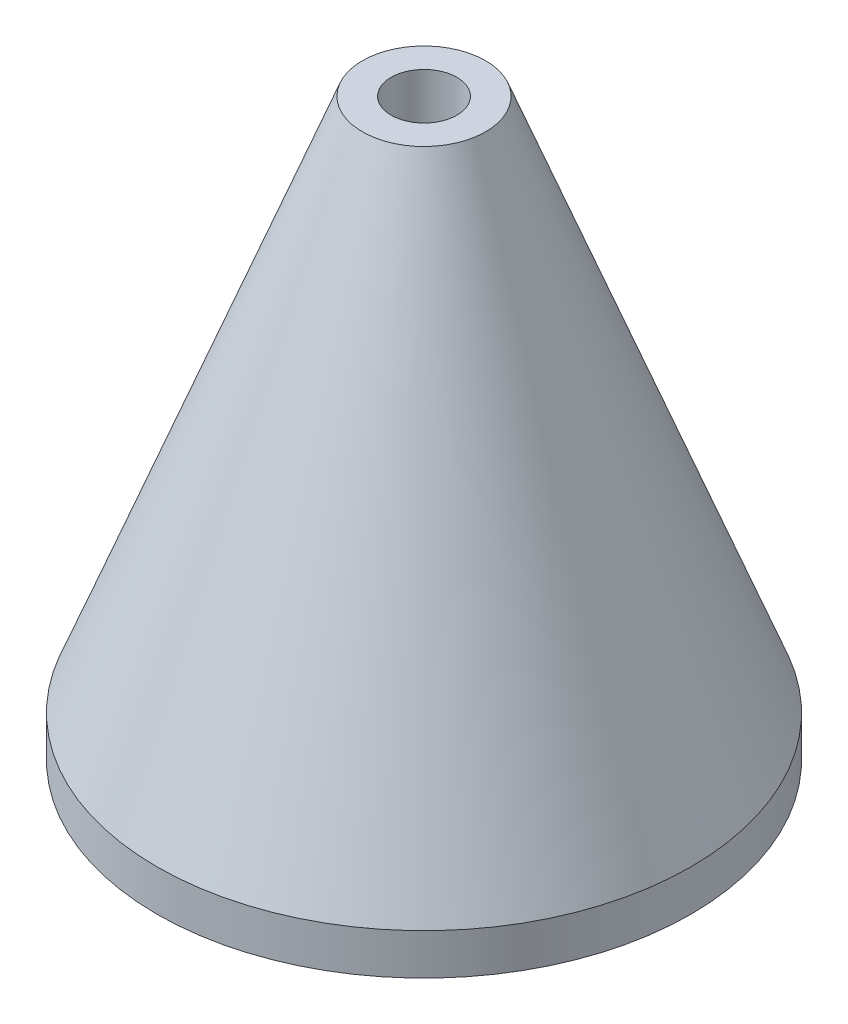
ISO-10303-21;
HEADER;
FILE_DESCRIPTION(('STEP AP214'),'2;1');
FILE_NAME('part.step','',(''),(''),'','','');
FILE_SCHEMA(('AUTOMOTIVE_DESIGN { 1 0 10303 214 1 1 1 1 }'));
ENDSEC;
DATA;
#1=APPLICATION_CONTEXT('core data for automotive mechanical design processes');
#2=APPLICATION_PROTOCOL_DEFINITION('international standard','automotive_design',2000,#1);
#3=PRODUCT_CONTEXT('',#1,'mechanical');
#4=PRODUCT('Part','Part','',(#3));
#5=PRODUCT_RELATED_PRODUCT_CATEGORY('part','',(#4));
#6=PRODUCT_DEFINITION_FORMATION('','',#4);
#7=PRODUCT_DEFINITION_CONTEXT('part definition',#1,'design');
#8=PRODUCT_DEFINITION('design','',#6,#7);
#9=PRODUCT_DEFINITION_SHAPE('','',#8);
#10=(LENGTH_UNIT() NAMED_UNIT(*) SI_UNIT(.MILLI.,.METRE.));
#11=(NAMED_UNIT(*) PLANE_ANGLE_UNIT() SI_UNIT($,.RADIAN.));
#12=(NAMED_UNIT(*) SI_UNIT($,.STERADIAN.) SOLID_ANGLE_UNIT());
#13=UNCERTAINTY_MEASURE_WITH_UNIT(LENGTH_MEASURE(1.E-05),#10,'distance_accuracy_value','');
#14=(GEOMETRIC_REPRESENTATION_CONTEXT(3) GLOBAL_UNCERTAINTY_ASSIGNED_CONTEXT((#13)) GLOBAL_UNIT_ASSIGNED_CONTEXT((#10,
#11,#12)) REPRESENTATION_CONTEXT('',''));
#15=CARTESIAN_POINT('',(0.,0.,0.));
#16=DIRECTION('',(0.,0.,1.));
#17=DIRECTION('',(1.,0.,0.));
#18=AXIS2_PLACEMENT_3D('',#15,#16,#17);
#19=CARTESIAN_POINT('',(0.,0.,0.));
#20=DIRECTION('',(0.,1.,0.));
#21=DIRECTION('',(0.,0.,1.));
#22=AXIS2_PLACEMENT_3D('',#19,#20,#21);
#23=CYLINDRICAL_SURFACE('',#22,2.1);
#24=CARTESIAN_POINT('',(0.,23.5,0.));
#25=DIRECTION('',(0.,1.,0.));
#26=DIRECTION('',(0.,0.,1.));
#27=AXIS2_PLACEMENT_3D('',#24,#25,#26);
#28=CIRCLE('',#27,2.1);
#29=CARTESIAN_POINT('',(0.,23.5,2.1));
#30=VERTEX_POINT('',#29);
#31=EDGE_CURVE('E10',#30,#30,#28,.T.);
#32=ORIENTED_EDGE('',*,*,#31,.T.);
#33=EDGE_LOOP('',(#32));
#34=FACE_BOUND('',#33,.T.);
#35=CARTESIAN_POINT('',(0.,0.,0.));
#36=DIRECTION('',(0.,1.,0.));
#37=DIRECTION('',(0.,0.,1.));
#38=AXIS2_PLACEMENT_3D('',#35,#36,#37);
#39=CIRCLE('',#38,2.1);
#40=CARTESIAN_POINT('',(0.,0.,2.1));
#41=VERTEX_POINT('',#40);
#42=EDGE_CURVE('E59',#41,#41,#39,.T.);
#43=ORIENTED_EDGE('',*,*,#42,.F.);
#44=EDGE_LOOP('',(#43));
#45=FACE_BOUND('',#44,.T.);
#46=ADVANCED_FACE('F38',(#34,#45),#23,.F.);
#47=CARTESIAN_POINT('',(0.,0.,0.));
#48=DIRECTION('',(0.,1.,0.));
#49=DIRECTION('',(0.,0.,1.));
#50=AXIS2_PLACEMENT_3D('',#47,#48,#49);
#51=PLANE('',#50);
#52=ORIENTED_EDGE('',*,*,#42,.T.);
#53=EDGE_LOOP('',(#52));
#54=FACE_BOUND('',#53,.T.);
#55=CARTESIAN_POINT('',(0.,0.,0.));
#56=DIRECTION('',(0.,1.,0.));
#57=DIRECTION('',(0.,0.,1.));
#58=AXIS2_PLACEMENT_3D('',#55,#56,#57);
#59=CIRCLE('',#58,32.5);
#60=CARTESIAN_POINT('',(0.,0.,32.5));
#61=VERTEX_POINT('',#60);
#62=EDGE_CURVE('E50',#61,#61,#59,.T.);
#63=ORIENTED_EDGE('',*,*,#62,.F.);
#64=EDGE_LOOP('',(#63));
#65=FACE_BOUND('',#64,.T.);
#66=ADVANCED_FACE('F95',(#54,#65),#51,.F.);
#67=CARTESIAN_POINT('',(0.,0.,0.));
#68=DIRECTION('',(0.,1.,0.));
#69=DIRECTION('',(0.,0.,1.));
#70=AXIS2_PLACEMENT_3D('',#67,#68,#69);
#71=CYLINDRICAL_SURFACE('',#70,32.5);
#72=CARTESIAN_POINT('',(0.,5.,0.));
#73=DIRECTION('',(0.,1.,0.));
#74=DIRECTION('',(0.,0.,1.));
#75=AXIS2_PLACEMENT_3D('',#72,#73,#74);
#76=CIRCLE('',#75,32.5);
#77=CARTESIAN_POINT('',(0.,5.,-32.5));
#78=VERTEX_POINT('',#77);
#79=EDGE_CURVE('E54',#78,#78,#76,.T.);
#80=ORIENTED_EDGE('',*,*,#79,.F.);
#81=EDGE_LOOP('',(#80));
#82=FACE_BOUND('',#81,.T.);
#83=ORIENTED_EDGE('',*,*,#62,.T.);
#84=EDGE_LOOP('',(#83));
#85=FACE_BOUND('',#84,.T.);
#86=ADVANCED_FACE('F89',(#82,#85),#71,.T.);
#87=CARTESIAN_POINT('',(0.,5.,0.));
#88=DIRECTION('',(0.,-1.,0.));
#89=DIRECTION('',(0.,0.,-1.));
#90=AXIS2_PLACEMENT_3D('',#87,#88,#89);
#91=CONICAL_SURFACE('',#90,32.5,0.367173833818219);
#92=CARTESIAN_POINT('',(0.,70.,0.));
#93=DIRECTION('',(0.,1.,0.));
#94=DIRECTION('',(0.,0.,1.));
#95=AXIS2_PLACEMENT_3D('',#92,#93,#94);
#96=CIRCLE('',#95,7.49999999999999);
#97=CARTESIAN_POINT('',(0.,70.,-7.49999999999999));
#98=VERTEX_POINT('',#97);
#99=EDGE_CURVE('E64',#98,#98,#96,.T.);
#100=CARTESIAN_POINT('',(0.,70.,-7.49999999999999));
#101=CARTESIAN_POINT('',(0.,69.3229166666667,-7.76041666666666));
#102=CARTESIAN_POINT('',(0.,68.6458333333333,-8.02083333333333));
#103=CARTESIAN_POINT('',(0.,67.2916666666667,-8.54166666666666));
#104=CARTESIAN_POINT('',(0.,66.6145833333333,-8.80208333333332));
#105=CARTESIAN_POINT('',(0.,65.2604166666667,-9.32291666666666));
#106=CARTESIAN_POINT('',(0.,64.5833333333333,-9.58333333333333));
#107=CARTESIAN_POINT('',(0.,63.2291666666667,-10.1041666666667));
#108=CARTESIAN_POINT('',(0.,62.5520833333333,-10.3645833333333));
#109=CARTESIAN_POINT('',(0.,61.1979166666667,-10.8854166666667));
#110=CARTESIAN_POINT('',(0.,60.5208333333333,-11.1458333333333));
#111=CARTESIAN_POINT('',(0.,59.1666666666667,-11.6666666666667));
#112=CARTESIAN_POINT('',(0.,58.4895833333333,-11.9270833333333));
#113=CARTESIAN_POINT('',(0.,57.1354166666667,-12.4479166666667));
#114=CARTESIAN_POINT('',(0.,56.4583333333333,-12.7083333333333));
#115=CARTESIAN_POINT('',(0.,55.1041666666667,-13.2291666666667));
#116=CARTESIAN_POINT('',(0.,54.4270833333333,-13.4895833333333));
#117=CARTESIAN_POINT('',(0.,53.0729166666667,-14.0104166666667));
#118=CARTESIAN_POINT('',(0.,52.3958333333333,-14.2708333333333));
#119=CARTESIAN_POINT('',(0.,51.0416666666667,-14.7916666666667));
#120=CARTESIAN_POINT('',(0.,50.3645833333333,-15.0520833333333));
#121=CARTESIAN_POINT('',(0.,49.0104166666667,-15.5729166666667));
#122=CARTESIAN_POINT('',(0.,48.3333333333333,-15.8333333333333));
#123=CARTESIAN_POINT('',(0.,46.9791666666667,-16.3541666666667));
#124=CARTESIAN_POINT('',(0.,46.3020833333333,-16.6145833333333));
#125=CARTESIAN_POINT('',(0.,44.9479166666667,-17.1354166666667));
#126=CARTESIAN_POINT('',(0.,44.2708333333333,-17.3958333333333));
#127=CARTESIAN_POINT('',(0.,42.9166666666667,-17.9166666666667));
#128=CARTESIAN_POINT('',(0.,42.2395833333333,-18.1770833333333));
#129=CARTESIAN_POINT('',(0.,40.8854166666667,-18.6979166666667));
#130=CARTESIAN_POINT('',(0.,40.2083333333333,-18.9583333333333));
#131=CARTESIAN_POINT('',(0.,38.8541666666667,-19.4791666666667));
#132=CARTESIAN_POINT('',(0.,38.1770833333333,-19.7395833333333));
#133=CARTESIAN_POINT('',(0.,36.8229166666667,-20.2604166666667));
#134=CARTESIAN_POINT('',(0.,36.1458333333333,-20.5208333333333));
#135=CARTESIAN_POINT('',(0.,34.7916666666667,-21.0416666666667));
#136=CARTESIAN_POINT('',(0.,34.1145833333333,-21.3020833333333));
#137=CARTESIAN_POINT('',(0.,32.7604166666667,-21.8229166666667));
#138=CARTESIAN_POINT('',(0.,32.0833333333333,-22.0833333333333));
#139=CARTESIAN_POINT('',(0.,30.7291666666667,-22.6041666666667));
#140=CARTESIAN_POINT('',(0.,30.0520833333333,-22.8645833333333));
#141=CARTESIAN_POINT('',(0.,28.6979166666667,-23.3854166666667));
#142=CARTESIAN_POINT('',(0.,28.0208333333333,-23.6458333333333));
#143=CARTESIAN_POINT('',(0.,26.6666666666667,-24.1666666666667));
#144=CARTESIAN_POINT('',(0.,25.9895833333333,-24.4270833333333));
#145=CARTESIAN_POINT('',(0.,24.6354166666667,-24.9479166666667));
#146=CARTESIAN_POINT('',(0.,23.9583333333333,-25.2083333333333));
#147=CARTESIAN_POINT('',(0.,22.6041666666667,-25.7291666666667));
#148=CARTESIAN_POINT('',(0.,21.9270833333333,-25.9895833333333));
#149=CARTESIAN_POINT('',(0.,20.5729166666667,-26.5104166666667));
#150=CARTESIAN_POINT('',(0.,19.8958333333333,-26.7708333333333));
#151=CARTESIAN_POINT('',(0.,18.5416666666667,-27.2916666666667));
#152=CARTESIAN_POINT('',(0.,17.8645833333333,-27.5520833333333));
#153=CARTESIAN_POINT('',(0.,16.5104166666667,-28.0729166666667));
#154=CARTESIAN_POINT('',(0.,15.8333333333333,-28.3333333333333));
#155=CARTESIAN_POINT('',(0.,14.4791666666667,-28.8541666666667));
#156=CARTESIAN_POINT('',(0.,13.8020833333333,-29.1145833333333));
#157=CARTESIAN_POINT('',(0.,12.4479166666667,-29.6354166666667));
#158=CARTESIAN_POINT('',(0.,11.7708333333333,-29.8958333333333));
#159=CARTESIAN_POINT('',(0.,10.4166666666667,-30.4166666666667));
#160=CARTESIAN_POINT('',(0.,9.73958333333333,-30.6770833333333));
#161=CARTESIAN_POINT('',(0.,8.38541666666666,-31.1979166666667));
#162=CARTESIAN_POINT('',(0.,7.70833333333333,-31.4583333333333));
#163=CARTESIAN_POINT('',(0.,6.35416666666667,-31.9791666666667));
#164=CARTESIAN_POINT('',(0.,5.67708333333333,-32.2395833333333));
#165=CARTESIAN_POINT('',(0.,5.,-32.5));
#166=B_SPLINE_CURVE_WITH_KNOTS('',3,(#100,#101,#102,#103,#104,#105,#106,#107,#108,#109,#110,
#111,#112,#113,#114,#115,#116,#117,#118,#119,#120,#121,#122,#123,#124,#125,#126,#127,#128,#129,
#130,#131,#132,#133,#134,#135,#136,#137,#138,#139,#140,#141,#142,#143,#144,#145,#146,#147,#148,
#149,#150,#151,#152,#153,#154,#155,#156,#157,#158,#159,#160,#161,#162,#163,#164,#165),
.UNSPECIFIED.,.F.,.F.,(4,2,2,2,2,2,2,2,2,2,2,2,2,2,2,2,2,2,2,2,2,2,2,2,2,2,2,2,2,2,2,2,4),(0.,
2.17631066831002,4.35262133662003,6.52893200493006,8.70524267324008,10.8815533415501,
13.0578640098601,15.2341746781701,17.4104853464802,19.5867960147902,21.7631066831002,
23.9394173514102,26.1157280197202,28.2920386880302,30.4683493563403,32.6446600246503,
34.8209706929603,36.9972813612703,39.1735920295803,41.3499026978904,43.5262133662004,
45.7025240345104,47.8788347028204,50.0551453711305,52.2314560394405,54.4077667077505,
56.5840773760605,58.7603880443705,60.9366987126806,63.1130093809906,65.2893200493006,
67.4656307176106,69.6419413859206),.UNSPECIFIED.);
#167=EDGE_CURVE('BSEAM83',#98,#78,#166,.T.);
#168=ORIENTED_EDGE('',*,*,#99,.F.);
#169=ORIENTED_EDGE('',*,*,#79,.T.);
#170=ORIENTED_EDGE('',*,*,#167,.T.);
#171=ORIENTED_EDGE('',*,*,#167,.F.);
#172=EDGE_LOOP('',(#168,#170,#169,#171));
#173=FACE_BOUND('',#172,.T.);
#174=ADVANCED_FACE('F83',(#173),#91,.T.);
#175=CARTESIAN_POINT('',(7.49999999999999,70.,0.));
#176=DIRECTION('',(0.,-1.,0.));
#177=DIRECTION('',(0.,0.,-1.));
#178=AXIS2_PLACEMENT_3D('',#175,#176,#177);
#179=PLANE('',#178);
#180=CARTESIAN_POINT('',(0.,70.,0.));
#181=DIRECTION('',(0.,-1.,0.));
#182=DIRECTION('',(0.,0.,-1.));
#183=AXIS2_PLACEMENT_3D('',#180,#181,#182);
#184=CIRCLE('',#183,4.);
#185=CARTESIAN_POINT('',(0.,70.,-4.));
#186=VERTEX_POINT('',#185);
#187=EDGE_CURVE('E57',#186,#186,#184,.F.);
#188=ORIENTED_EDGE('',*,*,#187,.F.);
#189=EDGE_LOOP('',(#188));
#190=FACE_BOUND('',#189,.T.);
#191=ORIENTED_EDGE('',*,*,#99,.T.);
#192=EDGE_LOOP('',(#191));
#193=FACE_BOUND('',#192,.T.);
#194=ADVANCED_FACE('F77',(#190,#193),#179,.F.);
#195=CARTESIAN_POINT('',(0.,70.000012,0.));
#196=DIRECTION('',(0.,-1.,0.));
#197=DIRECTION('',(0.,0.,-1.));
#198=AXIS2_PLACEMENT_3D('',#195,#196,#197);
#199=CYLINDRICAL_SURFACE('',#198,4.);
#200=CARTESIAN_POINT('',(0.,24.,0.));
#201=DIRECTION('',(0.,1.,0.));
#202=DIRECTION('',(0.,0.,1.));
#203=AXIS2_PLACEMENT_3D('',#200,#201,#202);
#204=CIRCLE('',#203,4.);
#205=CARTESIAN_POINT('',(0.,24.,-4.));
#206=VERTEX_POINT('',#205);
#207=EDGE_CURVE('E60',#206,#206,#204,.T.);
#208=CARTESIAN_POINT('',(0.,24.,-4.));
#209=CARTESIAN_POINT('',(0.,24.4791666666667,-4.));
#210=CARTESIAN_POINT('',(0.,24.9583333333333,-4.));
#211=CARTESIAN_POINT('',(0.,25.9166666666667,-4.));
#212=CARTESIAN_POINT('',(0.,26.3958333333333,-4.));
#213=CARTESIAN_POINT('',(0.,27.3541666666667,-4.));
#214=CARTESIAN_POINT('',(0.,27.8333333333333,-4.));
#215=CARTESIAN_POINT('',(0.,28.7916666666667,-4.));
#216=CARTESIAN_POINT('',(0.,29.2708333333333,-4.));
#217=CARTESIAN_POINT('',(0.,30.2291666666667,-4.));
#218=CARTESIAN_POINT('',(0.,30.7083333333333,-4.));
#219=CARTESIAN_POINT('',(0.,31.6666666666667,-4.));
#220=CARTESIAN_POINT('',(0.,32.1458333333333,-4.));
#221=CARTESIAN_POINT('',(0.,33.1041666666667,-4.));
#222=CARTESIAN_POINT('',(0.,33.5833333333333,-4.));
#223=CARTESIAN_POINT('',(0.,34.5416666666667,-4.));
#224=CARTESIAN_POINT('',(0.,35.0208333333333,-4.));
#225=CARTESIAN_POINT('',(0.,35.9791666666667,-4.));
#226=CARTESIAN_POINT('',(0.,36.4583333333333,-4.));
#227=CARTESIAN_POINT('',(0.,37.4166666666667,-4.));
#228=CARTESIAN_POINT('',(0.,37.8958333333333,-4.));
#229=CARTESIAN_POINT('',(0.,38.8541666666667,-4.));
#230=CARTESIAN_POINT('',(0.,39.3333333333333,-4.));
#231=CARTESIAN_POINT('',(0.,40.2916666666667,-4.));
#232=CARTESIAN_POINT('',(0.,40.7708333333333,-4.));
#233=CARTESIAN_POINT('',(0.,41.7291666666667,-4.));
#234=CARTESIAN_POINT('',(0.,42.2083333333333,-4.));
#235=CARTESIAN_POINT('',(0.,43.1666666666667,-4.));
#236=CARTESIAN_POINT('',(0.,43.6458333333333,-4.));
#237=CARTESIAN_POINT('',(0.,44.6041666666667,-4.));
#238=CARTESIAN_POINT('',(0.,45.0833333333333,-4.));
#239=CARTESIAN_POINT('',(0.,46.0416666666667,-4.));
#240=CARTESIAN_POINT('',(0.,46.5208333333333,-4.));
#241=CARTESIAN_POINT('',(0.,47.4791666666667,-4.));
#242=CARTESIAN_POINT('',(0.,47.9583333333333,-4.));
#243=CARTESIAN_POINT('',(0.,48.9166666666667,-4.));
#244=CARTESIAN_POINT('',(0.,49.3958333333333,-4.));
#245=CARTESIAN_POINT('',(0.,50.3541666666667,-4.));
#246=CARTESIAN_POINT('',(0.,50.8333333333333,-4.));
#247=CARTESIAN_POINT('',(0.,51.7916666666667,-4.));
#248=CARTESIAN_POINT('',(0.,52.2708333333333,-4.));
#249=CARTESIAN_POINT('',(0.,53.2291666666667,-4.));
#250=CARTESIAN_POINT('',(0.,53.7083333333333,-4.));
#251=CARTESIAN_POINT('',(0.,54.6666666666667,-4.));
#252=CARTESIAN_POINT('',(0.,55.1458333333333,-4.));
#253=CARTESIAN_POINT('',(0.,56.1041666666667,-4.));
#254=CARTESIAN_POINT('',(0.,56.5833333333333,-4.));
#255=CARTESIAN_POINT('',(0.,57.5416666666667,-4.));
#256=CARTESIAN_POINT('',(0.,58.0208333333333,-4.));
#257=CARTESIAN_POINT('',(0.,58.9791666666667,-4.));
#258=CARTESIAN_POINT('',(0.,59.4583333333333,-4.));
#259=CARTESIAN_POINT('',(0.,60.4166666666667,-4.));
#260=CARTESIAN_POINT('',(0.,60.8958333333333,-4.));
#261=CARTESIAN_POINT('',(0.,61.8541666666667,-4.));
#262=CARTESIAN_POINT('',(0.,62.3333333333333,-4.));
#263=CARTESIAN_POINT('',(0.,63.2916666666667,-4.));
#264=CARTESIAN_POINT('',(0.,63.7708333333333,-4.));
#265=CARTESIAN_POINT('',(0.,64.7291666666667,-4.));
#266=CARTESIAN_POINT('',(0.,65.2083333333333,-4.));
#267=CARTESIAN_POINT('',(0.,66.1666666666667,-4.));
#268=CARTESIAN_POINT('',(0.,66.6458333333333,-4.));
#269=CARTESIAN_POINT('',(0.,67.6041666666667,-4.));
#270=CARTESIAN_POINT('',(0.,68.0833333333333,-4.));
#271=CARTESIAN_POINT('',(0.,69.0416666666667,-4.));
#272=CARTESIAN_POINT('',(0.,69.5208333333334,-4.));
#273=CARTESIAN_POINT('',(0.,70.,-4.));
#274=B_SPLINE_CURVE_WITH_KNOTS('',3,(#208,#209,#210,#211,#212,#213,#214,#215,#216,#217,#218,
#219,#220,#221,#222,#223,#224,#225,#226,#227,#228,#229,#230,#231,#232,#233,#234,#235,#236,#237,
#238,#239,#240,#241,#242,#243,#244,#245,#246,#247,#248,#249,#250,#251,#252,#253,#254,#255,#256,
#257,#258,#259,#260,#261,#262,#263,#264,#265,#266,#267,#268,#269,#270,#271,#272,#273),
.UNSPECIFIED.,.F.,.F.,(4,2,2,2,2,2,2,2,2,2,2,2,2,2,2,2,2,2,2,2,2,2,2,2,2,2,2,2,2,2,2,2,4),(0.,
1.4375,2.875,4.3125,5.75000000000001,7.1875,8.62500000000001,10.0625,11.5,12.9375,14.375,
15.8125,17.25,18.6875,20.125,21.5625,23.,24.4375,25.875,27.3125,28.75,30.1875,31.625,33.0625,
34.5,35.9375,37.375,38.8125,40.25,41.6875,43.125,44.5625,46.),.UNSPECIFIED.);
#275=EDGE_CURVE('BSEAM74',#206,#186,#274,.T.);
#276=ORIENTED_EDGE('',*,*,#207,.F.);
#277=ORIENTED_EDGE('',*,*,#187,.T.);
#278=ORIENTED_EDGE('',*,*,#275,.T.);
#279=ORIENTED_EDGE('',*,*,#275,.F.);
#280=EDGE_LOOP('',(#276,#278,#277,#279));
#281=FACE_BOUND('',#280,.T.);
#282=ADVANCED_FACE('F74',(#281),#199,.F.);
#283=CARTESIAN_POINT('',(0.,24.,0.));
#284=DIRECTION('',(0.,1.,0.));
#285=DIRECTION('',(0.,0.,1.));
#286=AXIS2_PLACEMENT_3D('',#283,#284,#285);
#287=PLANE('',#286);
#288=CARTESIAN_POINT('',(0.,24.,0.));
#289=DIRECTION('',(0.,1.,0.));
#290=DIRECTION('',(0.,0.,1.));
#291=AXIS2_PLACEMENT_3D('',#288,#289,#290);
#292=CIRCLE('',#291,2.59999999999999);
#293=CARTESIAN_POINT('',(0.,24.,2.59999999999999));
#294=VERTEX_POINT('',#293);
#295=EDGE_CURVE('E46',#294,#294,#292,.F.);
#296=ORIENTED_EDGE('',*,*,#295,.T.);
#297=EDGE_LOOP('',(#296));
#298=FACE_BOUND('',#297,.T.);
#299=ORIENTED_EDGE('',*,*,#207,.T.);
#300=EDGE_LOOP('',(#299));
#301=FACE_BOUND('',#300,.T.);
#302=ADVANCED_FACE('F72',(#298,#301),#287,.T.);
#303=CARTESIAN_POINT('',(0.,24.,0.));
#304=DIRECTION('',(0.,1.,0.));
#305=DIRECTION('',(0.,0.,1.));
#306=AXIS2_PLACEMENT_3D('',#303,#304,#305);
#307=CONICAL_SURFACE('',#306,2.59999999999999,0.785398163397442);
#308=ORIENTED_EDGE('',*,*,#31,.F.);
#309=EDGE_LOOP('',(#308));
#310=FACE_BOUND('',#309,.T.);
#311=ORIENTED_EDGE('',*,*,#295,.F.);
#312=EDGE_LOOP('',(#311));
#313=FACE_BOUND('',#312,.T.);
#314=ADVANCED_FACE('F41',(#310,#313),#307,.F.);
#315=CLOSED_SHELL('',(#46,#66,#86,#174,#194,#282,#302,#314));
#316=MANIFOLD_SOLID_BREP('B2',#315);
#317=ADVANCED_BREP_SHAPE_REPRESENTATION('',(#18,#316),#14);
#318=SHAPE_DEFINITION_REPRESENTATION(#9,#317);
ENDSEC;
END-ISO-10303-21;
